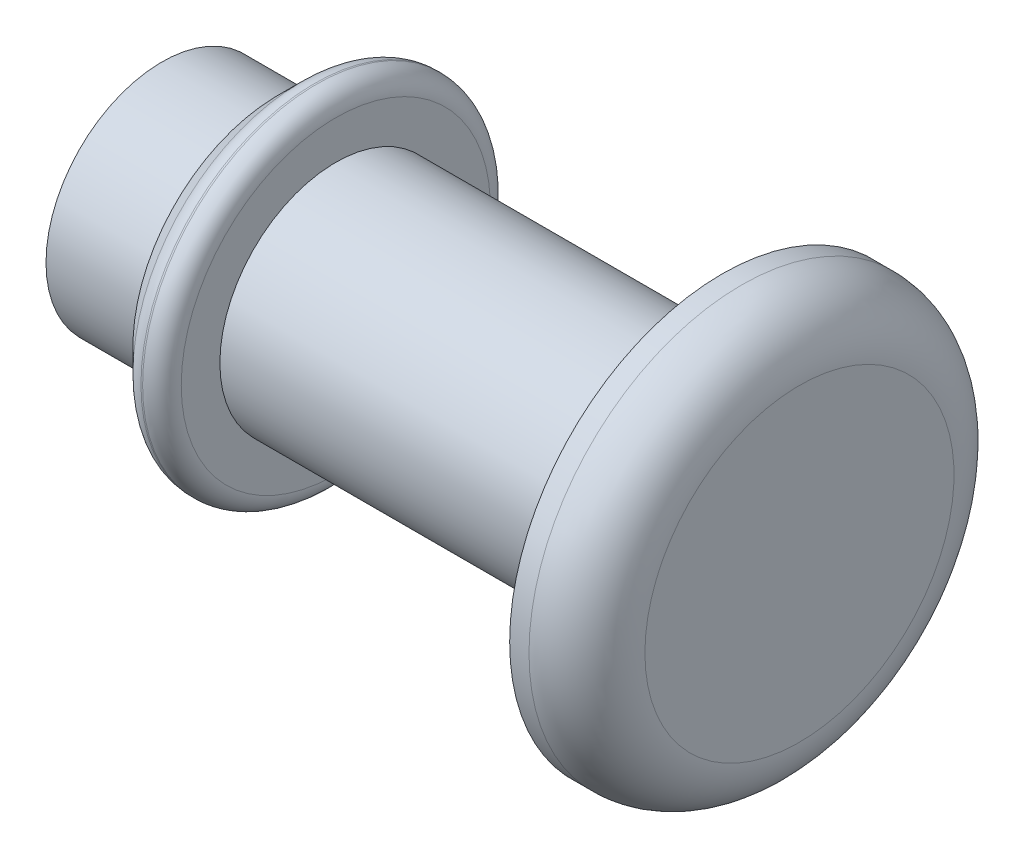
ISO-10303-21;
HEADER;
FILE_DESCRIPTION(('STEP AP214'),'2;1');
FILE_NAME('part.step','',(''),(''),'','','');
FILE_SCHEMA(('AUTOMOTIVE_DESIGN { 1 0 10303 214 1 1 1 1 }'));
ENDSEC;
DATA;
#1=APPLICATION_CONTEXT('core data for automotive mechanical design processes');
#2=APPLICATION_PROTOCOL_DEFINITION('international standard','automotive_design',2000,#1);
#3=PRODUCT_CONTEXT('',#1,'mechanical');
#4=PRODUCT('Part','Part','',(#3));
#5=PRODUCT_RELATED_PRODUCT_CATEGORY('part','',(#4));
#6=PRODUCT_DEFINITION_FORMATION('','',#4);
#7=PRODUCT_DEFINITION_CONTEXT('part definition',#1,'design');
#8=PRODUCT_DEFINITION('design','',#6,#7);
#9=PRODUCT_DEFINITION_SHAPE('','',#8);
#10=(LENGTH_UNIT() NAMED_UNIT(*) SI_UNIT(.MILLI.,.METRE.));
#11=(NAMED_UNIT(*) PLANE_ANGLE_UNIT() SI_UNIT($,.RADIAN.));
#12=(NAMED_UNIT(*) SI_UNIT($,.STERADIAN.) SOLID_ANGLE_UNIT());
#13=UNCERTAINTY_MEASURE_WITH_UNIT(LENGTH_MEASURE(1.E-05),#10,'distance_accuracy_value','');
#14=(GEOMETRIC_REPRESENTATION_CONTEXT(3) GLOBAL_UNCERTAINTY_ASSIGNED_CONTEXT((#13)) GLOBAL_UNIT_ASSIGNED_CONTEXT((#10,
#11,#12)) REPRESENTATION_CONTEXT('',''));
#15=CARTESIAN_POINT('',(0.,0.,0.));
#16=DIRECTION('',(0.,0.,1.));
#17=DIRECTION('',(1.,0.,0.));
#18=AXIS2_PLACEMENT_3D('',#15,#16,#17);
#19=CARTESIAN_POINT('',(0.,0.,0.));
#20=DIRECTION('',(-1.,0.,0.));
#21=DIRECTION('',(0.,0.,1.));
#22=AXIS2_PLACEMENT_3D('',#19,#20,#21);
#23=PLANE('',#22);
#24=CARTESIAN_POINT('',(0.,0.,0.));
#25=DIRECTION('',(-1.,0.,0.));
#26=DIRECTION('',(0.,0.,1.));
#27=AXIS2_PLACEMENT_3D('',#24,#25,#26);
#28=CIRCLE('',#27,4.);
#29=CARTESIAN_POINT('',(0.,0.,4.));
#30=VERTEX_POINT('',#29);
#31=EDGE_CURVE('E66',#30,#30,#28,.F.);
#32=ORIENTED_EDGE('',*,*,#31,.T.);
#33=EDGE_LOOP('',(#32));
#34=FACE_BOUND('',#33,.T.);
#35=ADVANCED_FACE('F43',(#34),#23,.F.);
#36=CARTESIAN_POINT('',(-42.3000178816333,0.,0.));
#37=DIRECTION('',(-1.,0.,0.));
#38=DIRECTION('',(0.,0.,1.));
#39=AXIS2_PLACEMENT_3D('',#36,#37,#38);
#40=CYLINDRICAL_SURFACE('',#39,5.5);
#41=CARTESIAN_POINT('',(-1.5,0.,0.));
#42=DIRECTION('',(-1.,0.,0.));
#43=DIRECTION('',(0.,0.,1.));
#44=AXIS2_PLACEMENT_3D('',#41,#42,#43);
#45=CIRCLE('',#44,5.5);
#46=CARTESIAN_POINT('',(-1.5,0.,5.5));
#47=VERTEX_POINT('',#46);
#48=EDGE_CURVE('E69',#47,#47,#45,.T.);
#49=ORIENTED_EDGE('',*,*,#48,.T.);
#50=EDGE_LOOP('',(#49));
#51=FACE_BOUND('',#50,.T.);
#52=CARTESIAN_POINT('',(-2.,0.,0.));
#53=DIRECTION('',(-1.,0.,0.));
#54=DIRECTION('',(0.,0.,1.));
#55=AXIS2_PLACEMENT_3D('',#52,#53,#54);
#56=CIRCLE('',#55,5.5);
#57=CARTESIAN_POINT('',(-2.,0.,5.5));
#58=VERTEX_POINT('',#57);
#59=EDGE_CURVE('E72',#58,#58,#56,.T.);
#60=ORIENTED_EDGE('',*,*,#59,.F.);
#61=EDGE_LOOP('',(#60));
#62=FACE_BOUND('',#61,.T.);
#63=ADVANCED_FACE('F110',(#51,#62),#40,.T.);
#64=CARTESIAN_POINT('',(-2.,5.5,0.));
#65=DIRECTION('',(1.,0.,0.));
#66=DIRECTION('',(0.,0.,-1.));
#67=AXIS2_PLACEMENT_3D('',#64,#65,#66);
#68=PLANE('',#67);
#69=CARTESIAN_POINT('',(-2.,0.,0.));
#70=DIRECTION('',(-1.,0.,0.));
#71=DIRECTION('',(0.,0.,1.));
#72=AXIS2_PLACEMENT_3D('',#69,#70,#71);
#73=CIRCLE('',#72,3.);
#74=CARTESIAN_POINT('',(-2.,0.,3.));
#75=VERTEX_POINT('',#74);
#76=EDGE_CURVE('E75',#75,#75,#73,.T.);
#77=ORIENTED_EDGE('',*,*,#76,.F.);
#78=EDGE_LOOP('',(#77));
#79=FACE_BOUND('',#78,.T.);
#80=ORIENTED_EDGE('',*,*,#59,.T.);
#81=EDGE_LOOP('',(#80));
#82=FACE_BOUND('',#81,.T.);
#83=ADVANCED_FACE('F117',(#79,#82),#68,.F.);
#84=CARTESIAN_POINT('',(-42.3000178816333,0.,0.));
#85=DIRECTION('',(-1.,0.,0.));
#86=DIRECTION('',(0.,0.,1.));
#87=AXIS2_PLACEMENT_3D('',#84,#85,#86);
#88=CYLINDRICAL_SURFACE('',#87,3.);
#89=CARTESIAN_POINT('',(-12.,0.,0.));
#90=DIRECTION('',(-1.,0.,0.));
#91=DIRECTION('',(0.,0.,1.));
#92=AXIS2_PLACEMENT_3D('',#89,#90,#91);
#93=CIRCLE('',#92,3.);
#94=CARTESIAN_POINT('',(-12.,0.,3.));
#95=VERTEX_POINT('',#94);
#96=EDGE_CURVE('E78',#95,#95,#93,.T.);
#97=ORIENTED_EDGE('',*,*,#96,.F.);
#98=EDGE_LOOP('',(#97));
#99=FACE_BOUND('',#98,.T.);
#100=ORIENTED_EDGE('',*,*,#76,.T.);
#101=EDGE_LOOP('',(#100));
#102=FACE_BOUND('',#101,.T.);
#103=ADVANCED_FACE('F193',(#99,#102),#88,.T.);
#104=CARTESIAN_POINT('',(-12.,3.,0.));
#105=DIRECTION('',(-1.,0.,0.));
#106=DIRECTION('',(0.,0.,1.));
#107=AXIS2_PLACEMENT_3D('',#104,#105,#106);
#108=PLANE('',#107);
#109=CARTESIAN_POINT('',(-12.,0.,0.));
#110=DIRECTION('',(-1.,0.,0.));
#111=DIRECTION('',(0.,0.,1.));
#112=AXIS2_PLACEMENT_3D('',#109,#110,#111);
#113=CIRCLE('',#112,4.);
#114=CARTESIAN_POINT('',(-12.,0.,4.));
#115=VERTEX_POINT('',#114);
#116=EDGE_CURVE('E10',#115,#115,#113,.F.);
#117=ORIENTED_EDGE('',*,*,#116,.T.);
#118=EDGE_LOOP('',(#117));
#119=FACE_BOUND('',#118,.T.);
#120=ORIENTED_EDGE('',*,*,#96,.T.);
#121=EDGE_LOOP('',(#120));
#122=FACE_BOUND('',#121,.T.);
#123=ADVANCED_FACE('F106',(#119,#122),#108,.F.);
#124=CARTESIAN_POINT('',(-42.3000178816333,0.,0.));
#125=DIRECTION('',(-1.,0.,0.));
#126=DIRECTION('',(0.,0.,1.));
#127=AXIS2_PLACEMENT_3D('',#124,#125,#126);
#128=CYLINDRICAL_SURFACE('',#127,4.5);
#129=CARTESIAN_POINT('',(-12.5428932188135,0.,0.));
#130=DIRECTION('',(-1.,0.,0.));
#131=DIRECTION('',(0.,0.,1.));
#132=AXIS2_PLACEMENT_3D('',#129,#130,#131);
#133=CIRCLE('',#132,4.5);
#134=CARTESIAN_POINT('',(-12.5428932188135,0.,4.5));
#135=VERTEX_POINT('',#134);
#136=EDGE_CURVE('E54',#135,#135,#133,.F.);
#137=ORIENTED_EDGE('',*,*,#136,.T.);
#138=EDGE_LOOP('',(#137));
#139=FACE_BOUND('',#138,.T.);
#140=CARTESIAN_POINT('',(-12.5,0.,0.));
#141=DIRECTION('',(-1.,0.,0.));
#142=DIRECTION('',(0.,0.,1.));
#143=AXIS2_PLACEMENT_3D('',#140,#141,#142);
#144=CIRCLE('',#143,4.5);
#145=CARTESIAN_POINT('',(-12.5,0.,4.5));
#146=VERTEX_POINT('',#145);
#147=EDGE_CURVE('E58',#146,#146,#144,.T.);
#148=ORIENTED_EDGE('',*,*,#147,.T.);
#149=EDGE_LOOP('',(#148));
#150=FACE_BOUND('',#149,.T.);
#151=ADVANCED_FACE('F98',(#139,#150),#128,.T.);
#152=CARTESIAN_POINT('',(-13.5,4.5,0.));
#153=DIRECTION('',(1.,0.,0.));
#154=DIRECTION('',(0.,0.,-1.));
#155=AXIS2_PLACEMENT_3D('',#152,#153,#154);
#156=PLANE('',#155);
#157=CARTESIAN_POINT('',(-13.5,0.,0.));
#158=DIRECTION('',(1.,0.,0.));
#159=DIRECTION('',(0.,0.,-1.));
#160=AXIS2_PLACEMENT_3D('',#157,#158,#159);
#161=CIRCLE('',#160,3.75);
#162=CARTESIAN_POINT('',(-13.5,0.,-3.75));
#163=VERTEX_POINT('',#162);
#164=EDGE_CURVE('E63',#163,#163,#161,.F.);
#165=ORIENTED_EDGE('',*,*,#164,.T.);
#166=EDGE_LOOP('',(#165));
#167=FACE_BOUND('',#166,.T.);
#168=CARTESIAN_POINT('',(-13.5,0.,0.));
#169=DIRECTION('',(-1.,0.,0.));
#170=DIRECTION('',(0.,0.,1.));
#171=AXIS2_PLACEMENT_3D('',#168,#169,#170);
#172=CIRCLE('',#171,3.);
#173=CARTESIAN_POINT('',(-13.5,0.,3.));
#174=VERTEX_POINT('',#173);
#175=EDGE_CURVE('E81',#174,#174,#172,.T.);
#176=ORIENTED_EDGE('',*,*,#175,.F.);
#177=EDGE_LOOP('',(#176));
#178=FACE_BOUND('',#177,.T.);
#179=ADVANCED_FACE('F93',(#167,#178),#156,.F.);
#180=CARTESIAN_POINT('',(-42.3000178816333,0.,0.));
#181=DIRECTION('',(-1.,0.,0.));
#182=DIRECTION('',(0.,0.,1.));
#183=AXIS2_PLACEMENT_3D('',#180,#181,#182);
#184=CYLINDRICAL_SURFACE('',#183,3.);
#185=CARTESIAN_POINT('',(-16.5,0.,0.));
#186=DIRECTION('',(-1.,0.,0.));
#187=DIRECTION('',(0.,0.,1.));
#188=AXIS2_PLACEMENT_3D('',#185,#186,#187);
#189=CIRCLE('',#188,3.);
#190=CARTESIAN_POINT('',(-16.5,0.,3.));
#191=VERTEX_POINT('',#190);
#192=EDGE_CURVE('E84',#191,#191,#189,.T.);
#193=ORIENTED_EDGE('',*,*,#192,.F.);
#194=EDGE_LOOP('',(#193));
#195=FACE_BOUND('',#194,.T.);
#196=ORIENTED_EDGE('',*,*,#175,.T.);
#197=EDGE_LOOP('',(#196));
#198=FACE_BOUND('',#197,.T.);
#199=ADVANCED_FACE('F90',(#195,#198),#184,.T.);
#200=CARTESIAN_POINT('',(-16.5,3.,0.));
#201=DIRECTION('',(1.,0.,0.));
#202=DIRECTION('',(0.,0.,-1.));
#203=AXIS2_PLACEMENT_3D('',#200,#201,#202);
#204=PLANE('',#203);
#205=ORIENTED_EDGE('',*,*,#192,.T.);
#206=EDGE_LOOP('',(#205));
#207=FACE_BOUND('',#206,.T.);
#208=ADVANCED_FACE('F88',(#207),#204,.F.);
#209=CARTESIAN_POINT('',(-1.5,0.,0.));
#210=DIRECTION('',(-1.,0.,0.));
#211=DIRECTION('',(0.,0.,1.));
#212=AXIS2_PLACEMENT_3D('',#209,#210,#211);
#213=TOROIDAL_SURFACE('',#212,4.,1.5);
#214=ORIENTED_EDGE('',*,*,#31,.F.);
#215=EDGE_LOOP('',(#214));
#216=FACE_BOUND('',#215,.T.);
#217=ORIENTED_EDGE('',*,*,#48,.F.);
#218=EDGE_LOOP('',(#217));
#219=FACE_BOUND('',#218,.T.);
#220=ADVANCED_FACE('F122',(#216,#219),#213,.T.);
#221=CARTESIAN_POINT('',(-13.5,0.,0.));
#222=DIRECTION('',(1.,0.,0.));
#223=DIRECTION('',(0.,0.,-1.));
#224=AXIS2_PLACEMENT_3D('',#221,#222,#223);
#225=CONICAL_SURFACE('',#224,3.75,0.785398163397447);
#226=CARTESIAN_POINT('',(-12.8964466094067,0.,0.));
#227=DIRECTION('',(1.,0.,0.));
#228=DIRECTION('',(0.,0.,-1.));
#229=AXIS2_PLACEMENT_3D('',#226,#227,#228);
#230=CIRCLE('',#229,4.35355339059327);
#231=CARTESIAN_POINT('',(-12.8964466094067,0.,-4.35355339059327));
#232=VERTEX_POINT('',#231);
#233=EDGE_CURVE('E50',#232,#232,#230,.F.);
#234=ORIENTED_EDGE('',*,*,#233,.T.);
#235=EDGE_LOOP('',(#234));
#236=FACE_BOUND('',#235,.T.);
#237=ORIENTED_EDGE('',*,*,#164,.F.);
#238=EDGE_LOOP('',(#237));
#239=FACE_BOUND('',#238,.T.);
#240=ADVANCED_FACE('F124',(#236,#239),#225,.T.);
#241=CARTESIAN_POINT('',(-12.5428932188135,0.,0.));
#242=DIRECTION('',(-1.,0.,0.));
#243=DIRECTION('',(0.,0.,1.));
#244=AXIS2_PLACEMENT_3D('',#241,#242,#243);
#245=TOROIDAL_SURFACE('',#244,4.,0.5);
#246=ORIENTED_EDGE('',*,*,#233,.F.);
#247=EDGE_LOOP('',(#246));
#248=FACE_BOUND('',#247,.T.);
#249=ORIENTED_EDGE('',*,*,#136,.F.);
#250=EDGE_LOOP('',(#249));
#251=FACE_BOUND('',#250,.T.);
#252=ADVANCED_FACE('F130',(#248,#251),#245,.T.);
#253=CARTESIAN_POINT('',(-12.5,0.,0.));
#254=DIRECTION('',(-1.,0.,0.));
#255=DIRECTION('',(0.,0.,1.));
#256=AXIS2_PLACEMENT_3D('',#253,#254,#255);
#257=TOROIDAL_SURFACE('',#256,4.,0.5);
#258=ORIENTED_EDGE('',*,*,#116,.F.);
#259=EDGE_LOOP('',(#258));
#260=FACE_BOUND('',#259,.T.);
#261=ORIENTED_EDGE('',*,*,#147,.F.);
#262=EDGE_LOOP('',(#261));
#263=FACE_BOUND('',#262,.T.);
#264=ADVANCED_FACE('F45',(#260,#263),#257,.T.);
#265=CLOSED_SHELL('',(#35,#63,#83,#103,#123,#151,#179,#199,#208,#220,#240,#252,#264));
#266=MANIFOLD_SOLID_BREP('B2',#265);
#267=ADVANCED_BREP_SHAPE_REPRESENTATION('',(#18,#266),#14);
#268=SHAPE_DEFINITION_REPRESENTATION(#9,#267);
ENDSEC;
END-ISO-10303-21;
